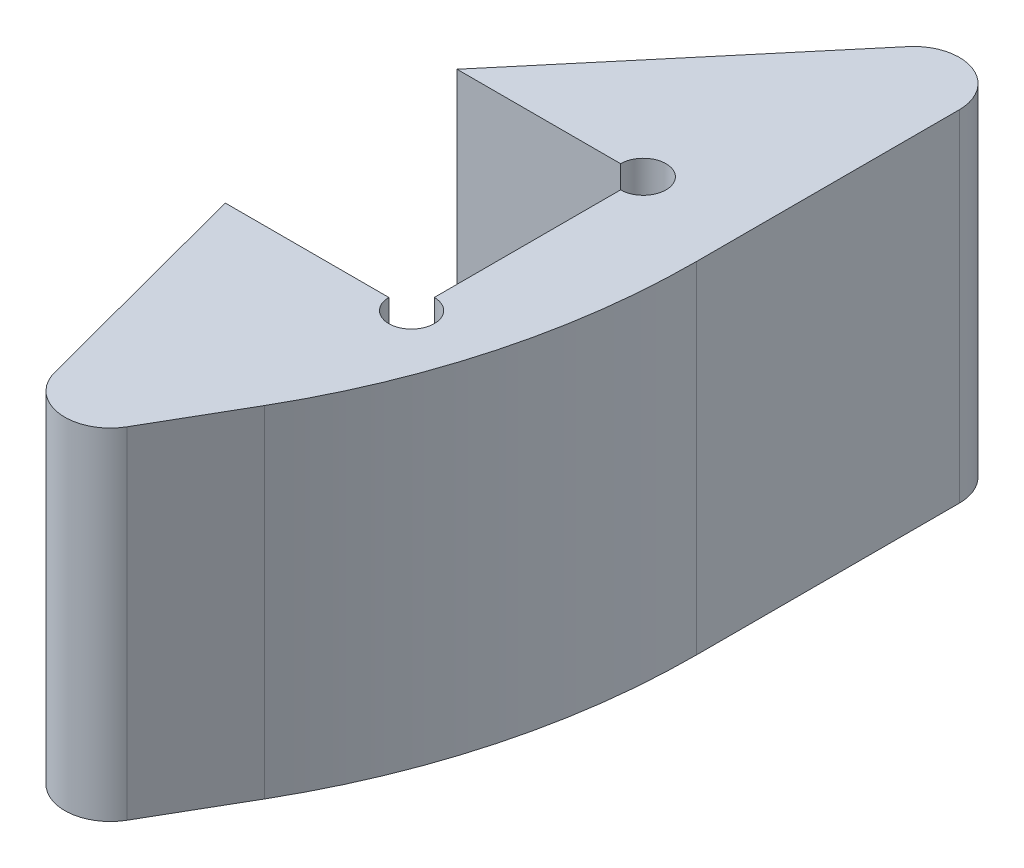
ISO-10303-21;
HEADER;
FILE_DESCRIPTION(('STEP AP214'),'2;1');
FILE_NAME('part.step','',(''),(''),'','','');
FILE_SCHEMA(('AUTOMOTIVE_DESIGN { 1 0 10303 214 1 1 1 1 }'));
ENDSEC;
DATA;
#1=APPLICATION_CONTEXT('core data for automotive mechanical design processes');
#2=APPLICATION_PROTOCOL_DEFINITION('international standard','automotive_design',2000,#1);
#3=PRODUCT_CONTEXT('',#1,'mechanical');
#4=PRODUCT('Part','Part','',(#3));
#5=PRODUCT_RELATED_PRODUCT_CATEGORY('part','',(#4));
#6=PRODUCT_DEFINITION_FORMATION('','',#4);
#7=PRODUCT_DEFINITION_CONTEXT('part definition',#1,'design');
#8=PRODUCT_DEFINITION('design','',#6,#7);
#9=PRODUCT_DEFINITION_SHAPE('','',#8);
#10=(LENGTH_UNIT() NAMED_UNIT(*) SI_UNIT(.MILLI.,.METRE.));
#11=(NAMED_UNIT(*) PLANE_ANGLE_UNIT() SI_UNIT($,.RADIAN.));
#12=(NAMED_UNIT(*) SI_UNIT($,.STERADIAN.) SOLID_ANGLE_UNIT());
#13=UNCERTAINTY_MEASURE_WITH_UNIT(LENGTH_MEASURE(1.E-05),#10,'distance_accuracy_value','');
#14=(GEOMETRIC_REPRESENTATION_CONTEXT(3) GLOBAL_UNCERTAINTY_ASSIGNED_CONTEXT((#13)) GLOBAL_UNIT_ASSIGNED_CONTEXT((#10,
#11,#12)) REPRESENTATION_CONTEXT('',''));
#15=CARTESIAN_POINT('',(0.,0.,0.));
#16=DIRECTION('',(0.,0.,1.));
#17=DIRECTION('',(1.,0.,0.));
#18=AXIS2_PLACEMENT_3D('',#15,#16,#17);
#19=CARTESIAN_POINT('',(-4.1,15.,0.));
#20=DIRECTION('',(-1.,0.,0.));
#21=DIRECTION('',(0.,0.,1.));
#22=AXIS2_PLACEMENT_3D('',#19,#20,#21);
#23=PLANE('',#22);
#24=DIRECTION('',(0.,-1.,0.));
#25=VECTOR('',#24,1.);
#26=CARTESIAN_POINT('',(-4.1,15.,5.1));
#27=LINE('',#26,#25);
#28=CARTESIAN_POINT('',(-4.1,5.,5.1));
#29=VERTEX_POINT('',#28);
#30=CARTESIAN_POINT('',(-4.1,0.,5.1));
#31=VERTEX_POINT('',#30);
#32=EDGE_CURVE('E187',#29,#31,#27,.T.);
#33=ORIENTED_EDGE('',*,*,#32,.F.);
#34=DIRECTION('',(0.,0.,1.));
#35=VECTOR('',#34,1.);
#36=CARTESIAN_POINT('',(-4.1,5.,5.1));
#37=LINE('',#36,#35);
#38=CARTESIAN_POINT('',(-4.1,5.,-5.1));
#39=VERTEX_POINT('',#38);
#40=EDGE_CURVE('E159',#39,#29,#37,.T.);
#41=ORIENTED_EDGE('',*,*,#40,.F.);
#42=DIRECTION('',(0.,-1.,0.));
#43=VECTOR('',#42,1.);
#44=CARTESIAN_POINT('',(-4.1,15.,-5.1));
#45=LINE('',#44,#43);
#46=CARTESIAN_POINT('',(-4.1,0.,-5.1));
#47=VERTEX_POINT('',#46);
#48=EDGE_CURVE('E206',#39,#47,#45,.T.);
#49=ORIENTED_EDGE('',*,*,#48,.T.);
#50=DIRECTION('',(0.,0.,-1.));
#51=VECTOR('',#50,1.);
#52=CARTESIAN_POINT('',(-4.1,0.,0.));
#53=LINE('',#52,#51);
#54=EDGE_CURVE('E191',#31,#47,#53,.T.);
#55=ORIENTED_EDGE('',*,*,#54,.F.);
#56=EDGE_LOOP('',(#33,#41,#49,#55));
#57=FACE_BOUND('',#56,.T.);
#58=ADVANCED_FACE('F37',(#57),#23,.T.);
#59=CARTESIAN_POINT('',(0.,15.,0.));
#60=DIRECTION('',(0.,-1.,0.));
#61=DIRECTION('',(0.,0.,-1.));
#62=AXIS2_PLACEMENT_3D('',#59,#60,#61);
#63=CYLINDRICAL_SURFACE('',#62,1.75);
#64=CARTESIAN_POINT('',(0.,0.,0.));
#65=DIRECTION('',(0.,1.,0.));
#66=DIRECTION('',(0.,0.,1.));
#67=AXIS2_PLACEMENT_3D('',#64,#65,#66);
#68=CIRCLE('',#67,1.75);
#69=CARTESIAN_POINT('',(0.,0.,1.75));
#70=VERTEX_POINT('',#69);
#71=EDGE_CURVE('E181',#70,#70,#68,.T.);
#72=ORIENTED_EDGE('',*,*,#71,.F.);
#73=EDGE_LOOP('',(#72));
#74=FACE_BOUND('',#73,.T.);
#75=CARTESIAN_POINT('',(0.,5.,0.));
#76=DIRECTION('',(0.,1.,0.));
#77=DIRECTION('',(0.,0.,1.));
#78=AXIS2_PLACEMENT_3D('',#75,#76,#77);
#79=CIRCLE('',#78,1.75);
#80=CARTESIAN_POINT('',(0.,5.,1.75));
#81=VERTEX_POINT('',#80);
#82=EDGE_CURVE('E170',#81,#81,#79,.T.);
#83=ORIENTED_EDGE('',*,*,#82,.T.);
#84=EDGE_LOOP('',(#83));
#85=FACE_BOUND('',#84,.T.);
#86=ADVANCED_FACE('F266',(#74,#85),#63,.F.);
#87=CARTESIAN_POINT('',(-4.9155722326454,15.,-4.12908067542214));
#88=DIRECTION('',(-0.765704864789611,0.,-0.643192086423273));
#89=DIRECTION('',(-0.643192086423273,0.,0.765704864789611));
#90=AXIS2_PLACEMENT_3D('',#87,#88,#89);
#91=PLANE('',#90);
#92=DIRECTION('',(0.643192086423273,0.,-0.765704864789611));
#93=VECTOR('',#92,1.);
#94=CARTESIAN_POINT('',(-4.9155722326454,15.,-4.12908067542214));
#95=LINE('',#94,#93);
#96=CARTESIAN_POINT('',(-4.1,15.,-5.1));
#97=VERTEX_POINT('',#96);
#98=CARTESIAN_POINT('',(4.96859027042078,15.,-15.89594079812));
#99=VERTEX_POINT('',#98);
#100=EDGE_CURVE('E177',#97,#99,#95,.T.);
#101=ORIENTED_EDGE('',*,*,#100,.T.);
#102=DIRECTION('',(0.,-1.,0.));
#103=VECTOR('',#102,1.);
#104=CARTESIAN_POINT('',(4.96859027042078,15.,-15.89594079812));
#105=LINE('',#104,#103);
#106=CARTESIAN_POINT('',(4.96859027042078,0.,-15.89594079812));
#107=VERTEX_POINT('',#106);
#108=EDGE_CURVE('E222',#99,#107,#105,.T.);
#109=ORIENTED_EDGE('',*,*,#108,.T.);
#110=DIRECTION('',(0.643192086423273,0.,-0.765704864789611));
#111=VECTOR('',#110,1.);
#112=CARTESIAN_POINT('',(-4.9155722326454,0.,-4.12908067542214));
#113=LINE('',#112,#111);
#114=EDGE_CURVE('E188',#47,#107,#113,.T.);
#115=ORIENTED_EDGE('',*,*,#114,.F.);
#116=ORIENTED_EDGE('',*,*,#48,.F.);
#117=EDGE_CURVE('E207',#97,#39,#45,.T.);
#118=ORIENTED_EDGE('',*,*,#117,.F.);
#119=EDGE_LOOP('',(#101,#109,#115,#116,#118));
#120=FACE_BOUND('',#119,.T.);
#121=ADVANCED_FACE('F272',(#120),#91,.T.);
#122=CARTESIAN_POINT('',(-5.09246897926321,15.,1.346512355601));
#123=DIRECTION('',(-0.966775359644736,0.,0.255627471105495));
#124=DIRECTION('',(0.255627471105495,0.,0.966775359644736));
#125=AXIS2_PLACEMENT_3D('',#122,#123,#124);
#126=PLANE('',#125);
#127=DIRECTION('',(-0.255627471105495,0.,-0.966775359644736));
#128=VECTOR('',#127,1.);
#129=CARTESIAN_POINT('',(-5.09246897926321,0.,1.346512355601));
#130=LINE('',#129,#128);
#131=CARTESIAN_POINT('',(-1.40032071649539,0.,15.310105349587));
#132=VERTEX_POINT('',#131);
#133=EDGE_CURVE('E194',#132,#31,#130,.T.);
#134=ORIENTED_EDGE('',*,*,#133,.F.);
#135=DIRECTION('',(0.,-1.,0.));
#136=VECTOR('',#135,1.);
#137=CARTESIAN_POINT('',(-1.40032071649539,15.,15.310105349587));
#138=LINE('',#137,#136);
#139=CARTESIAN_POINT('',(-1.40032071649539,15.,15.310105349587));
#140=VERTEX_POINT('',#139);
#141=EDGE_CURVE('E11',#132,#140,#138,.F.);
#142=ORIENTED_EDGE('',*,*,#141,.T.);
#143=DIRECTION('',(-0.255627471105495,0.,-0.966775359644736));
#144=VECTOR('',#143,1.);
#145=CARTESIAN_POINT('',(-5.09246897926321,15.,1.346512355601));
#146=LINE('',#145,#144);
#147=CARTESIAN_POINT('',(-4.1,15.,5.1));
#148=VERTEX_POINT('',#147);
#149=EDGE_CURVE('E180',#140,#148,#146,.T.);
#150=ORIENTED_EDGE('',*,*,#149,.T.);
#151=EDGE_CURVE('E203',#148,#29,#27,.T.);
#152=ORIENTED_EDGE('',*,*,#151,.T.);
#153=ORIENTED_EDGE('',*,*,#32,.T.);
#154=EDGE_LOOP('',(#134,#142,#150,#152,#153));
#155=FACE_BOUND('',#154,.T.);
#156=ADVANCED_FACE('F277',(#155),#126,.T.);
#157=CARTESIAN_POINT('',(8.5400635094611,15.,4.93060796608388));
#158=DIRECTION('',(0.866025403784438,0.,0.500000000000001));
#159=DIRECTION('',(0.500000000000001,0.,-0.866025403784438));
#160=AXIS2_PLACEMENT_3D('',#157,#158,#159);
#161=PLANE('',#160);
#162=DIRECTION('',(-0.500000000000001,0.,0.866025403784438));
#163=VECTOR('',#162,1.);
#164=CARTESIAN_POINT('',(8.5400635094611,15.,4.93060796608388));
#165=LINE('',#164,#163);
#166=CARTESIAN_POINT('',(4.48076211353314,15.,11.9615242270663));
#167=VERTEX_POINT('',#166);
#168=CARTESIAN_POINT('',(2.26528081036295,15.,15.798850407376));
#169=VERTEX_POINT('',#168);
#170=EDGE_CURVE('E183',#167,#169,#165,.T.);
#171=ORIENTED_EDGE('',*,*,#170,.T.);
#172=DIRECTION('',(0.,-1.,0.));
#173=VECTOR('',#172,1.);
#174=CARTESIAN_POINT('',(2.26528081036295,15.,15.798850407376));
#175=LINE('',#174,#173);
#176=CARTESIAN_POINT('',(2.26528081036295,0.,15.798850407376));
#177=VERTEX_POINT('',#176);
#178=EDGE_CURVE('E45',#169,#177,#175,.T.);
#179=ORIENTED_EDGE('',*,*,#178,.T.);
#180=DIRECTION('',(-0.500000000000001,0.,0.866025403784438));
#181=VECTOR('',#180,1.);
#182=CARTESIAN_POINT('',(8.5400635094611,0.,4.93060796608388));
#183=LINE('',#182,#181);
#184=CARTESIAN_POINT('',(4.48076211353314,0.,11.9615242270663));
#185=VERTEX_POINT('',#184);
#186=EDGE_CURVE('E196',#185,#177,#183,.T.);
#187=ORIENTED_EDGE('',*,*,#186,.F.);
#188=DIRECTION('',(0.,-1.,0.));
#189=VECTOR('',#188,1.);
#190=CARTESIAN_POINT('',(4.48076211353315,15.,11.9615242270663));
#191=LINE('',#190,#189);
#192=EDGE_CURVE('E217',#185,#167,#191,.F.);
#193=ORIENTED_EDGE('',*,*,#192,.T.);
#194=EDGE_LOOP('',(#171,#179,#187,#193));
#195=FACE_BOUND('',#194,.T.);
#196=ADVANCED_FACE('F237',(#195),#161,.T.);
#197=CARTESIAN_POINT('',(8.5,15.,0.));
#198=DIRECTION('',(1.,0.,0.));
#199=DIRECTION('',(0.,0.,-1.));
#200=AXIS2_PLACEMENT_3D('',#197,#198,#199);
#201=PLANE('',#200);
#202=DIRECTION('',(0.,0.,1.));
#203=VECTOR('',#202,1.);
#204=CARTESIAN_POINT('',(8.5,0.,0.));
#205=LINE('',#204,#203);
#206=CARTESIAN_POINT('',(8.5,0.,-14.6095566252734));
#207=VERTEX_POINT('',#206);
#208=CARTESIAN_POINT('',(8.5,0.,-3.03847577293369));
#209=VERTEX_POINT('',#208);
#210=EDGE_CURVE('E199',#207,#209,#205,.T.);
#211=ORIENTED_EDGE('',*,*,#210,.F.);
#212=DIRECTION('',(0.,-1.,0.));
#213=VECTOR('',#212,1.);
#214=CARTESIAN_POINT('',(8.5,15.,-14.6095566252734));
#215=LINE('',#214,#213);
#216=CARTESIAN_POINT('',(8.5,15.,-14.6095566252734));
#217=VERTEX_POINT('',#216);
#218=EDGE_CURVE('E229',#207,#217,#215,.F.);
#219=ORIENTED_EDGE('',*,*,#218,.T.);
#220=DIRECTION('',(0.,0.,1.));
#221=VECTOR('',#220,1.);
#222=CARTESIAN_POINT('',(8.5,15.,0.));
#223=LINE('',#222,#221);
#224=CARTESIAN_POINT('',(8.5,15.,-3.03847577293369));
#225=VERTEX_POINT('',#224);
#226=EDGE_CURVE('E185',#217,#225,#223,.T.);
#227=ORIENTED_EDGE('',*,*,#226,.T.);
#228=DIRECTION('',(0.,-1.,0.));
#229=VECTOR('',#228,1.);
#230=CARTESIAN_POINT('',(8.5,15.,-3.03847577293369));
#231=LINE('',#230,#229);
#232=EDGE_CURVE('E210',#225,#209,#231,.T.);
#233=ORIENTED_EDGE('',*,*,#232,.T.);
#234=EDGE_LOOP('',(#211,#219,#227,#233));
#235=FACE_BOUND('',#234,.T.);
#236=ADVANCED_FACE('F250',(#235),#201,.T.);
#237=CARTESIAN_POINT('',(0.,15.,0.));
#238=DIRECTION('',(0.,1.,0.));
#239=DIRECTION('',(0.,0.,1.));
#240=AXIS2_PLACEMENT_3D('',#237,#238,#239);
#241=PLANE('',#240);
#242=ORIENTED_EDGE('',*,*,#226,.F.);
#243=CARTESIAN_POINT('',(6.5,15.,-14.6095566252734));
#244=DIRECTION('',(0.,1.,0.));
#245=DIRECTION('',(0.,0.,1.));
#246=AXIS2_PLACEMENT_3D('',#243,#244,#245);
#247=CIRCLE('',#246,2.);
#248=EDGE_CURVE('E232',#217,#99,#247,.T.);
#249=ORIENTED_EDGE('',*,*,#248,.T.);
#250=ORIENTED_EDGE('',*,*,#100,.F.);
#251=DIRECTION('',(-1.,0.,0.));
#252=VECTOR('',#251,1.);
#253=CARTESIAN_POINT('',(4.1,15.,-5.1));
#254=LINE('',#253,#252);
#255=CARTESIAN_POINT('',(3.1,15.,-5.1));
#256=VERTEX_POINT('',#255);
#257=EDGE_CURVE('E165',#256,#97,#254,.T.);
#258=ORIENTED_EDGE('',*,*,#257,.F.);
#259=CARTESIAN_POINT('',(4.1,15.,-5.1));
#260=DIRECTION('',(0.,1.,0.));
#261=DIRECTION('',(0.,0.,1.));
#262=AXIS2_PLACEMENT_3D('',#259,#260,#261);
#263=CIRCLE('',#262,1.);
#264=CARTESIAN_POINT('',(4.1,15.,-4.1));
#265=VERTEX_POINT('',#264);
#266=EDGE_CURVE('E142',#265,#256,#263,.T.);
#267=ORIENTED_EDGE('',*,*,#266,.F.);
#268=DIRECTION('',(0.,0.,-1.));
#269=VECTOR('',#268,1.);
#270=CARTESIAN_POINT('',(4.1,15.,5.1));
#271=LINE('',#270,#269);
#272=CARTESIAN_POINT('',(4.1,15.,4.1));
#273=VERTEX_POINT('',#272);
#274=EDGE_CURVE('E172',#273,#265,#271,.T.);
#275=ORIENTED_EDGE('',*,*,#274,.F.);
#276=CARTESIAN_POINT('',(4.1,15.,5.1));
#277=DIRECTION('',(0.,1.,0.));
#278=DIRECTION('',(0.,0.,1.));
#279=AXIS2_PLACEMENT_3D('',#276,#277,#278);
#280=CIRCLE('',#279,1.);
#281=CARTESIAN_POINT('',(3.1,15.,5.1));
#282=VERTEX_POINT('',#281);
#283=EDGE_CURVE('E143',#282,#273,#280,.T.);
#284=ORIENTED_EDGE('',*,*,#283,.F.);
#285=DIRECTION('',(1.,0.,0.));
#286=VECTOR('',#285,1.);
#287=CARTESIAN_POINT('',(4.1,15.,5.1));
#288=LINE('',#287,#286);
#289=EDGE_CURVE('E152',#148,#282,#288,.T.);
#290=ORIENTED_EDGE('',*,*,#289,.F.);
#291=ORIENTED_EDGE('',*,*,#149,.F.);
#292=CARTESIAN_POINT('',(0.533230002794078,15.,14.798850407376));
#293=DIRECTION('',(0.,1.,0.));
#294=DIRECTION('',(0.,0.,1.));
#295=AXIS2_PLACEMENT_3D('',#292,#293,#294);
#296=CIRCLE('',#295,2.);
#297=EDGE_CURVE('E57',#140,#169,#296,.T.);
#298=ORIENTED_EDGE('',*,*,#297,.T.);
#299=ORIENTED_EDGE('',*,*,#170,.F.);
#300=CARTESIAN_POINT('',(-21.5,15.,-3.03847577293369));
#301=DIRECTION('',(0.,1.,0.));
#302=DIRECTION('',(0.,0.,1.));
#303=AXIS2_PLACEMENT_3D('',#300,#301,#302);
#304=CIRCLE('',#303,30.);
#305=EDGE_CURVE('E219',#167,#225,#304,.T.);
#306=ORIENTED_EDGE('',*,*,#305,.T.);
#307=EDGE_LOOP('',(#242,#249,#250,#258,#267,#275,#284,#290,#291,#298,#299,#306));
#308=FACE_BOUND('',#307,.T.);
#309=ADVANCED_FACE('F254',(#308),#241,.T.);
#310=CARTESIAN_POINT('',(0.,0.,0.));
#311=DIRECTION('',(0.,1.,0.));
#312=DIRECTION('',(0.,0.,1.));
#313=AXIS2_PLACEMENT_3D('',#310,#311,#312);
#314=PLANE('',#313);
#315=ORIENTED_EDGE('',*,*,#114,.T.);
#316=CARTESIAN_POINT('',(6.5,0.,-14.6095566252734));
#317=DIRECTION('',(0.,1.,0.));
#318=DIRECTION('',(0.,0.,1.));
#319=AXIS2_PLACEMENT_3D('',#316,#317,#318);
#320=CIRCLE('',#319,2.);
#321=EDGE_CURVE('E227',#107,#207,#320,.F.);
#322=ORIENTED_EDGE('',*,*,#321,.T.);
#323=ORIENTED_EDGE('',*,*,#210,.T.);
#324=CARTESIAN_POINT('',(-21.5,0.,-3.03847577293369));
#325=DIRECTION('',(0.,1.,0.));
#326=DIRECTION('',(0.,0.,1.));
#327=AXIS2_PLACEMENT_3D('',#324,#325,#326);
#328=CIRCLE('',#327,30.);
#329=EDGE_CURVE('E215',#209,#185,#328,.F.);
#330=ORIENTED_EDGE('',*,*,#329,.T.);
#331=ORIENTED_EDGE('',*,*,#186,.T.);
#332=CARTESIAN_POINT('',(0.533230002794078,0.,14.798850407376));
#333=DIRECTION('',(0.,1.,0.));
#334=DIRECTION('',(0.,0.,1.));
#335=AXIS2_PLACEMENT_3D('',#332,#333,#334);
#336=CIRCLE('',#335,2.);
#337=EDGE_CURVE('E225',#177,#132,#336,.F.);
#338=ORIENTED_EDGE('',*,*,#337,.T.);
#339=ORIENTED_EDGE('',*,*,#133,.T.);
#340=ORIENTED_EDGE('',*,*,#54,.T.);
#341=EDGE_LOOP('',(#315,#322,#323,#330,#331,#338,#339,#340));
#342=FACE_BOUND('',#341,.T.);
#343=ORIENTED_EDGE('',*,*,#71,.T.);
#344=EDGE_LOOP('',(#343));
#345=FACE_BOUND('',#344,.T.);
#346=ADVANCED_FACE('F241',(#342,#345),#314,.F.);
#347=CARTESIAN_POINT('',(4.1,5.,-5.1));
#348=DIRECTION('',(0.,0.,-1.));
#349=DIRECTION('',(-1.,0.,0.));
#350=AXIS2_PLACEMENT_3D('',#347,#348,#349);
#351=PLANE('',#350);
#352=DIRECTION('',(-1.,0.,0.));
#353=VECTOR('',#352,1.);
#354=CARTESIAN_POINT('',(4.1,5.,-5.1));
#355=LINE('',#354,#353);
#356=CARTESIAN_POINT('',(3.1,5.,-5.1));
#357=VERTEX_POINT('',#356);
#358=EDGE_CURVE('E163',#357,#39,#355,.T.);
#359=ORIENTED_EDGE('',*,*,#358,.F.);
#360=DIRECTION('',(0.,1.,0.));
#361=VECTOR('',#360,1.);
#362=CARTESIAN_POINT('',(3.1,2.17157287525381,-5.1));
#363=LINE('',#362,#361);
#364=EDGE_CURVE('E173',#357,#256,#363,.T.);
#365=ORIENTED_EDGE('',*,*,#364,.T.);
#366=ORIENTED_EDGE('',*,*,#257,.T.);
#367=ORIENTED_EDGE('',*,*,#117,.T.);
#368=EDGE_LOOP('',(#359,#365,#366,#367));
#369=FACE_BOUND('',#368,.T.);
#370=ADVANCED_FACE('F261',(#369),#351,.F.);
#371=CARTESIAN_POINT('',(4.1,5.,5.1));
#372=DIRECTION('',(1.,0.,0.));
#373=DIRECTION('',(0.,0.,-1.));
#374=AXIS2_PLACEMENT_3D('',#371,#372,#373);
#375=PLANE('',#374);
#376=ORIENTED_EDGE('',*,*,#274,.T.);
#377=DIRECTION('',(0.,1.,0.));
#378=VECTOR('',#377,1.);
#379=CARTESIAN_POINT('',(4.1,2.17157287525381,-4.1));
#380=LINE('',#379,#378);
#381=CARTESIAN_POINT('',(4.1,5.,-4.1));
#382=VERTEX_POINT('',#381);
#383=EDGE_CURVE('E308',#265,#382,#380,.F.);
#384=ORIENTED_EDGE('',*,*,#383,.T.);
#385=DIRECTION('',(0.,0.,-1.));
#386=VECTOR('',#385,1.);
#387=CARTESIAN_POINT('',(4.1,5.,5.1));
#388=LINE('',#387,#386);
#389=CARTESIAN_POINT('',(4.1,5.,4.1));
#390=VERTEX_POINT('',#389);
#391=EDGE_CURVE('E161',#390,#382,#388,.T.);
#392=ORIENTED_EDGE('',*,*,#391,.F.);
#393=DIRECTION('',(0.,1.,0.));
#394=VECTOR('',#393,1.);
#395=CARTESIAN_POINT('',(4.1,2.17157287525381,4.1));
#396=LINE('',#395,#394);
#397=EDGE_CURVE('E137',#390,#273,#396,.T.);
#398=ORIENTED_EDGE('',*,*,#397,.T.);
#399=EDGE_LOOP('',(#376,#384,#392,#398));
#400=FACE_BOUND('',#399,.T.);
#401=ADVANCED_FACE('F312',(#400),#375,.F.);
#402=CARTESIAN_POINT('',(4.1,5.,5.1));
#403=DIRECTION('',(0.,0.,1.));
#404=DIRECTION('',(1.,0.,0.));
#405=AXIS2_PLACEMENT_3D('',#402,#403,#404);
#406=PLANE('',#405);
#407=ORIENTED_EDGE('',*,*,#289,.T.);
#408=DIRECTION('',(0.,1.,0.));
#409=VECTOR('',#408,1.);
#410=CARTESIAN_POINT('',(3.1,2.17157287525381,5.1));
#411=LINE('',#410,#409);
#412=CARTESIAN_POINT('',(3.1,5.,5.1));
#413=VERTEX_POINT('',#412);
#414=EDGE_CURVE('E134',#282,#413,#411,.F.);
#415=ORIENTED_EDGE('',*,*,#414,.T.);
#416=DIRECTION('',(1.,0.,0.));
#417=VECTOR('',#416,1.);
#418=CARTESIAN_POINT('',(4.1,5.,5.1));
#419=LINE('',#418,#417);
#420=EDGE_CURVE('E149',#29,#413,#419,.T.);
#421=ORIENTED_EDGE('',*,*,#420,.F.);
#422=ORIENTED_EDGE('',*,*,#151,.F.);
#423=EDGE_LOOP('',(#407,#415,#421,#422));
#424=FACE_BOUND('',#423,.T.);
#425=ADVANCED_FACE('F147',(#424),#406,.F.);
#426=CARTESIAN_POINT('',(0.,5.,0.));
#427=DIRECTION('',(0.,1.,0.));
#428=DIRECTION('',(0.,0.,1.));
#429=AXIS2_PLACEMENT_3D('',#426,#427,#428);
#430=PLANE('',#429);
#431=CARTESIAN_POINT('',(4.1,5.,-5.1));
#432=DIRECTION('',(0.,1.,0.));
#433=DIRECTION('',(0.,0.,1.));
#434=AXIS2_PLACEMENT_3D('',#431,#432,#433);
#435=CIRCLE('',#434,1.);
#436=EDGE_CURVE('E153',#357,#382,#435,.F.);
#437=ORIENTED_EDGE('',*,*,#436,.F.);
#438=ORIENTED_EDGE('',*,*,#358,.T.);
#439=ORIENTED_EDGE('',*,*,#40,.T.);
#440=ORIENTED_EDGE('',*,*,#420,.T.);
#441=CARTESIAN_POINT('',(4.1,5.,5.1));
#442=DIRECTION('',(0.,1.,0.));
#443=DIRECTION('',(0.,0.,1.));
#444=AXIS2_PLACEMENT_3D('',#441,#442,#443);
#445=CIRCLE('',#444,1.);
#446=EDGE_CURVE('E131',#390,#413,#445,.F.);
#447=ORIENTED_EDGE('',*,*,#446,.F.);
#448=ORIENTED_EDGE('',*,*,#391,.T.);
#449=EDGE_LOOP('',(#437,#438,#439,#440,#447,#448));
#450=FACE_BOUND('',#449,.T.);
#451=ORIENTED_EDGE('',*,*,#82,.F.);
#452=EDGE_LOOP('',(#451));
#453=FACE_BOUND('',#452,.T.);
#454=ADVANCED_FACE('F156',(#450,#453),#430,.T.);
#455=CARTESIAN_POINT('',(4.1,2.17157287525381,5.1));
#456=DIRECTION('',(0.,1.,0.));
#457=DIRECTION('',(0.,0.,1.));
#458=AXIS2_PLACEMENT_3D('',#455,#456,#457);
#459=CYLINDRICAL_SURFACE('',#458,1.);
#460=ORIENTED_EDGE('',*,*,#446,.T.);
#461=ORIENTED_EDGE('',*,*,#414,.F.);
#462=ORIENTED_EDGE('',*,*,#283,.T.);
#463=ORIENTED_EDGE('',*,*,#397,.F.);
#464=EDGE_LOOP('',(#460,#461,#462,#463));
#465=FACE_BOUND('',#464,.T.);
#466=ADVANCED_FACE('F133',(#465),#459,.F.);
#467=CARTESIAN_POINT('',(4.1,2.17157287525381,-5.1));
#468=DIRECTION('',(0.,1.,0.));
#469=DIRECTION('',(0.,0.,1.));
#470=AXIS2_PLACEMENT_3D('',#467,#468,#469);
#471=CYLINDRICAL_SURFACE('',#470,1.);
#472=ORIENTED_EDGE('',*,*,#436,.T.);
#473=ORIENTED_EDGE('',*,*,#383,.F.);
#474=ORIENTED_EDGE('',*,*,#266,.T.);
#475=ORIENTED_EDGE('',*,*,#364,.F.);
#476=EDGE_LOOP('',(#472,#473,#474,#475));
#477=FACE_BOUND('',#476,.T.);
#478=ADVANCED_FACE('F284',(#477),#471,.F.);
#479=CARTESIAN_POINT('',(-21.5,15.,-3.03847577293369));
#480=DIRECTION('',(0.,-1.,0.));
#481=DIRECTION('',(0.,0.,-1.));
#482=AXIS2_PLACEMENT_3D('',#479,#480,#481);
#483=CYLINDRICAL_SURFACE('',#482,30.);
#484=ORIENTED_EDGE('',*,*,#305,.F.);
#485=ORIENTED_EDGE('',*,*,#192,.F.);
#486=ORIENTED_EDGE('',*,*,#329,.F.);
#487=ORIENTED_EDGE('',*,*,#232,.F.);
#488=EDGE_LOOP('',(#484,#485,#486,#487));
#489=FACE_BOUND('',#488,.T.);
#490=ADVANCED_FACE('F248',(#489),#483,.T.);
#491=CARTESIAN_POINT('',(6.5,15.,-14.6095566252734));
#492=DIRECTION('',(0.,-1.,0.));
#493=DIRECTION('',(0.,0.,-1.));
#494=AXIS2_PLACEMENT_3D('',#491,#492,#493);
#495=CYLINDRICAL_SURFACE('',#494,2.);
#496=ORIENTED_EDGE('',*,*,#248,.F.);
#497=ORIENTED_EDGE('',*,*,#218,.F.);
#498=ORIENTED_EDGE('',*,*,#321,.F.);
#499=ORIENTED_EDGE('',*,*,#108,.F.);
#500=EDGE_LOOP('',(#496,#497,#498,#499));
#501=FACE_BOUND('',#500,.T.);
#502=ADVANCED_FACE('F283',(#501),#495,.T.);
#503=CARTESIAN_POINT('',(0.533230002794078,15.,14.798850407376));
#504=DIRECTION('',(0.,-1.,0.));
#505=DIRECTION('',(0.,0.,-1.));
#506=AXIS2_PLACEMENT_3D('',#503,#504,#505);
#507=CYLINDRICAL_SURFACE('',#506,2.);
#508=ORIENTED_EDGE('',*,*,#297,.F.);
#509=ORIENTED_EDGE('',*,*,#141,.F.);
#510=ORIENTED_EDGE('',*,*,#337,.F.);
#511=ORIENTED_EDGE('',*,*,#178,.F.);
#512=EDGE_LOOP('',(#508,#509,#510,#511));
#513=FACE_BOUND('',#512,.T.);
#514=ADVANCED_FACE('F39',(#513),#507,.T.);
#515=CLOSED_SHELL('',(#58,#86,#121,#156,#196,#236,#309,#346,#370,#401,#425,#454,#466,#478,#490,
#502,#514));
#516=MANIFOLD_SOLID_BREP('B2',#515);
#517=ADVANCED_BREP_SHAPE_REPRESENTATION('',(#18,#516),#14);
#518=SHAPE_DEFINITION_REPRESENTATION(#9,#517);
ENDSEC;
END-ISO-10303-21;
